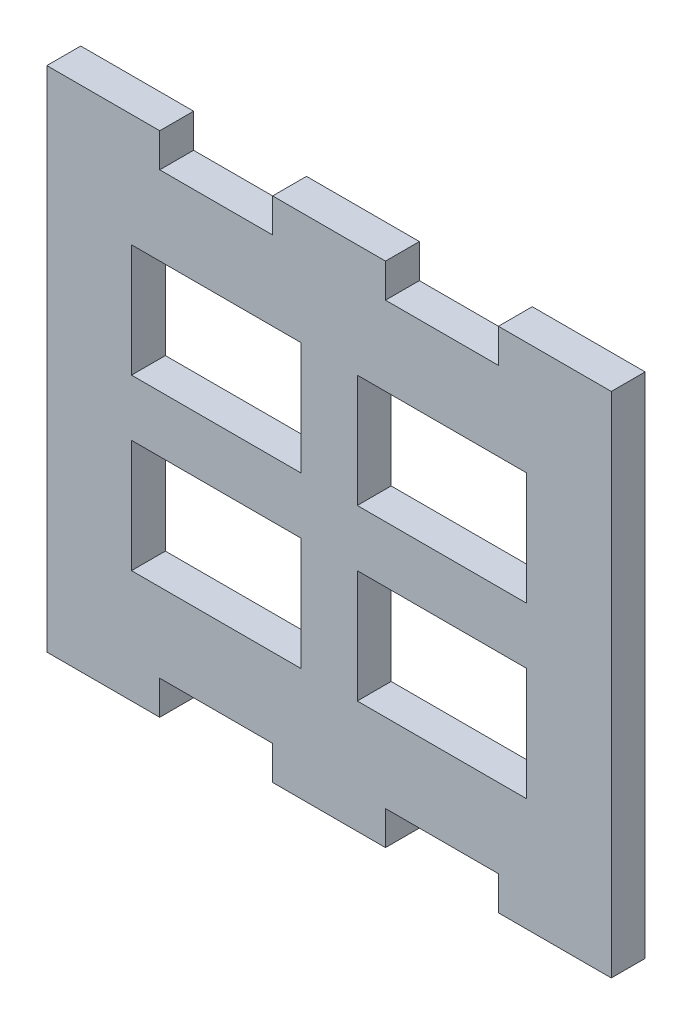
ISO-10303-21;
HEADER;
FILE_DESCRIPTION(('STEP AP214'),'2;1');
FILE_NAME('part.step','',(''),(''),'','','');
FILE_SCHEMA(('AUTOMOTIVE_DESIGN { 1 0 10303 214 1 1 1 1 }'));
ENDSEC;
DATA;
#1=APPLICATION_CONTEXT('core data for automotive mechanical design processes');
#2=APPLICATION_PROTOCOL_DEFINITION('international standard','automotive_design',2000,#1);
#3=PRODUCT_CONTEXT('',#1,'mechanical');
#4=PRODUCT('Part','Part','',(#3));
#5=PRODUCT_RELATED_PRODUCT_CATEGORY('part','',(#4));
#6=PRODUCT_DEFINITION_FORMATION('','',#4);
#7=PRODUCT_DEFINITION_CONTEXT('part definition',#1,'design');
#8=PRODUCT_DEFINITION('design','',#6,#7);
#9=PRODUCT_DEFINITION_SHAPE('','',#8);
#10=(LENGTH_UNIT() NAMED_UNIT(*) SI_UNIT(.MILLI.,.METRE.));
#11=(NAMED_UNIT(*) PLANE_ANGLE_UNIT() SI_UNIT($,.RADIAN.));
#12=(NAMED_UNIT(*) SI_UNIT($,.STERADIAN.) SOLID_ANGLE_UNIT());
#13=UNCERTAINTY_MEASURE_WITH_UNIT(LENGTH_MEASURE(1.E-05),#10,'distance_accuracy_value','');
#14=(GEOMETRIC_REPRESENTATION_CONTEXT(3) GLOBAL_UNCERTAINTY_ASSIGNED_CONTEXT((#13)) GLOBAL_UNIT_ASSIGNED_CONTEXT((#10,
#11,#12)) REPRESENTATION_CONTEXT('',''));
#15=CARTESIAN_POINT('',(0.,0.,0.));
#16=DIRECTION('',(0.,0.,1.));
#17=DIRECTION('',(1.,0.,0.));
#18=AXIS2_PLACEMENT_3D('',#15,#16,#17);
#19=CARTESIAN_POINT('',(0.,45.,3.));
#20=DIRECTION('',(0.,-1.,0.));
#21=DIRECTION('',(0.,0.,-1.));
#22=AXIS2_PLACEMENT_3D('',#19,#20,#21);
#23=PLANE('',#22);
#24=DIRECTION('',(-1.,0.,0.));
#25=VECTOR('',#24,1.);
#26=CARTESIAN_POINT('',(0.,45.,3.));
#27=LINE('',#26,#25);
#28=CARTESIAN_POINT('',(30.,45.,3.));
#29=VERTEX_POINT('',#28);
#30=CARTESIAN_POINT('',(20.,45.,3.));
#31=VERTEX_POINT('',#30);
#32=EDGE_CURVE('E439',#29,#31,#27,.T.);
#33=ORIENTED_EDGE('',*,*,#32,.F.);
#34=DIRECTION('',(0.,0.,1.));
#35=VECTOR('',#34,1.);
#36=CARTESIAN_POINT('',(30.,45.,-7.));
#37=LINE('',#36,#35);
#38=CARTESIAN_POINT('',(30.,45.,0.));
#39=VERTEX_POINT('',#38);
#40=EDGE_CURVE('E279',#39,#29,#37,.T.);
#41=ORIENTED_EDGE('',*,*,#40,.F.);
#42=DIRECTION('',(-1.,0.,0.));
#43=VECTOR('',#42,1.);
#44=CARTESIAN_POINT('',(0.,45.,0.));
#45=LINE('',#44,#43);
#46=CARTESIAN_POINT('',(20.,45.,0.));
#47=VERTEX_POINT('',#46);
#48=EDGE_CURVE('E452',#39,#47,#45,.T.);
#49=ORIENTED_EDGE('',*,*,#48,.T.);
#50=DIRECTION('',(0.,0.,1.));
#51=VECTOR('',#50,1.);
#52=CARTESIAN_POINT('',(20.,45.,-7.));
#53=LINE('',#52,#51);
#54=EDGE_CURVE('E305',#47,#31,#53,.T.);
#55=ORIENTED_EDGE('',*,*,#54,.T.);
#56=EDGE_LOOP('',(#33,#41,#49,#55));
#57=FACE_BOUND('',#56,.T.);
#58=ADVANCED_FACE('F33',(#57),#23,.F.);
#59=CARTESIAN_POINT('',(10.,45.,3.));
#60=VERTEX_POINT('',#59);
#61=CARTESIAN_POINT('',(0.,45.,3.));
#62=VERTEX_POINT('',#61);
#63=EDGE_CURVE('E435',#60,#62,#27,.T.);
#64=ORIENTED_EDGE('',*,*,#63,.F.);
#65=DIRECTION('',(0.,0.,1.));
#66=VECTOR('',#65,1.);
#67=CARTESIAN_POINT('',(10.,45.,-7.));
#68=LINE('',#67,#66);
#69=CARTESIAN_POINT('',(10.,45.,0.));
#70=VERTEX_POINT('',#69);
#71=EDGE_CURVE('E302',#70,#60,#68,.T.);
#72=ORIENTED_EDGE('',*,*,#71,.F.);
#73=CARTESIAN_POINT('',(0.,45.,0.));
#74=VERTEX_POINT('',#73);
#75=EDGE_CURVE('E449',#70,#74,#45,.T.);
#76=ORIENTED_EDGE('',*,*,#75,.T.);
#77=DIRECTION('',(0.,0.,-1.));
#78=VECTOR('',#77,1.);
#79=CARTESIAN_POINT('',(0.,45.,3.));
#80=LINE('',#79,#78);
#81=EDGE_CURVE('E438',#62,#74,#80,.T.);
#82=ORIENTED_EDGE('',*,*,#81,.F.);
#83=EDGE_LOOP('',(#64,#72,#76,#82));
#84=FACE_BOUND('',#83,.T.);
#85=ADVANCED_FACE('F540',(#84),#23,.F.);
#86=CARTESIAN_POINT('',(0.,0.,3.));
#87=DIRECTION('',(0.,1.,0.));
#88=DIRECTION('',(0.,0.,1.));
#89=AXIS2_PLACEMENT_3D('',#86,#87,#88);
#90=PLANE('',#89);
#91=DIRECTION('',(1.,0.,0.));
#92=VECTOR('',#91,1.);
#93=CARTESIAN_POINT('',(0.,0.,0.));
#94=LINE('',#93,#92);
#95=CARTESIAN_POINT('',(20.,0.,0.));
#96=VERTEX_POINT('',#95);
#97=CARTESIAN_POINT('',(30.,0.,0.));
#98=VERTEX_POINT('',#97);
#99=EDGE_CURVE('E447',#96,#98,#94,.T.);
#100=ORIENTED_EDGE('',*,*,#99,.T.);
#101=DIRECTION('',(0.,0.,1.));
#102=VECTOR('',#101,1.);
#103=CARTESIAN_POINT('',(30.,0.,-7.));
#104=LINE('',#103,#102);
#105=CARTESIAN_POINT('',(30.,0.,3.));
#106=VERTEX_POINT('',#105);
#107=EDGE_CURVE('E397',#98,#106,#104,.T.);
#108=ORIENTED_EDGE('',*,*,#107,.T.);
#109=DIRECTION('',(1.,0.,0.));
#110=VECTOR('',#109,1.);
#111=CARTESIAN_POINT('',(0.,0.,3.));
#112=LINE('',#111,#110);
#113=CARTESIAN_POINT('',(20.,0.,3.));
#114=VERTEX_POINT('',#113);
#115=EDGE_CURVE('E433',#114,#106,#112,.T.);
#116=ORIENTED_EDGE('',*,*,#115,.F.);
#117=DIRECTION('',(0.,0.,1.));
#118=VECTOR('',#117,1.);
#119=CARTESIAN_POINT('',(20.,0.,-7.));
#120=LINE('',#119,#118);
#121=EDGE_CURVE('E420',#96,#114,#120,.T.);
#122=ORIENTED_EDGE('',*,*,#121,.F.);
#123=EDGE_LOOP('',(#100,#108,#116,#122));
#124=FACE_BOUND('',#123,.T.);
#125=ADVANCED_FACE('F565',(#124),#90,.F.);
#126=CARTESIAN_POINT('',(0.,0.,0.));
#127=VERTEX_POINT('',#126);
#128=CARTESIAN_POINT('',(10.,0.,0.));
#129=VERTEX_POINT('',#128);
#130=EDGE_CURVE('E443',#127,#129,#94,.T.);
#131=ORIENTED_EDGE('',*,*,#130,.T.);
#132=DIRECTION('',(0.,0.,1.));
#133=VECTOR('',#132,1.);
#134=CARTESIAN_POINT('',(10.,0.,-7.));
#135=LINE('',#134,#133);
#136=CARTESIAN_POINT('',(10.,0.,3.));
#137=VERTEX_POINT('',#136);
#138=EDGE_CURVE('E414',#129,#137,#135,.T.);
#139=ORIENTED_EDGE('',*,*,#138,.T.);
#140=CARTESIAN_POINT('',(0.,0.,3.));
#141=VERTEX_POINT('',#140);
#142=EDGE_CURVE('E429',#141,#137,#112,.T.);
#143=ORIENTED_EDGE('',*,*,#142,.F.);
#144=DIRECTION('',(0.,0.,-1.));
#145=VECTOR('',#144,1.);
#146=CARTESIAN_POINT('',(0.,0.,3.));
#147=LINE('',#146,#145);
#148=EDGE_CURVE('E461',#141,#127,#147,.T.);
#149=ORIENTED_EDGE('',*,*,#148,.T.);
#150=EDGE_LOOP('',(#131,#139,#143,#149));
#151=FACE_BOUND('',#150,.T.);
#152=ADVANCED_FACE('F545',(#151),#90,.F.);
#153=CARTESIAN_POINT('',(0.,0.,3.));
#154=DIRECTION('',(1.,0.,0.));
#155=DIRECTION('',(0.,0.,-1.));
#156=AXIS2_PLACEMENT_3D('',#153,#154,#155);
#157=PLANE('',#156);
#158=DIRECTION('',(0.,-1.,0.));
#159=VECTOR('',#158,1.);
#160=CARTESIAN_POINT('',(0.,0.,0.));
#161=LINE('',#160,#159);
#162=EDGE_CURVE('E417',#74,#127,#161,.T.);
#163=ORIENTED_EDGE('',*,*,#162,.T.);
#164=ORIENTED_EDGE('',*,*,#148,.F.);
#165=DIRECTION('',(0.,-1.,0.));
#166=VECTOR('',#165,1.);
#167=CARTESIAN_POINT('',(0.,0.,3.));
#168=LINE('',#167,#166);
#169=EDGE_CURVE('E424',#62,#141,#168,.T.);
#170=ORIENTED_EDGE('',*,*,#169,.F.);
#171=ORIENTED_EDGE('',*,*,#81,.T.);
#172=EDGE_LOOP('',(#163,#164,#170,#171));
#173=FACE_BOUND('',#172,.T.);
#174=ADVANCED_FACE('F35',(#173),#157,.F.);
#175=CARTESIAN_POINT('',(40.,0.,3.));
#176=VERTEX_POINT('',#175);
#177=CARTESIAN_POINT('',(50.,0.,3.));
#178=VERTEX_POINT('',#177);
#179=EDGE_CURVE('E427',#176,#178,#112,.T.);
#180=ORIENTED_EDGE('',*,*,#179,.F.);
#181=DIRECTION('',(0.,0.,1.));
#182=VECTOR('',#181,1.);
#183=CARTESIAN_POINT('',(40.,0.,-7.));
#184=LINE('',#183,#182);
#185=CARTESIAN_POINT('',(40.,0.,0.));
#186=VERTEX_POINT('',#185);
#187=EDGE_CURVE('E403',#186,#176,#184,.T.);
#188=ORIENTED_EDGE('',*,*,#187,.F.);
#189=CARTESIAN_POINT('',(50.,0.,0.));
#190=VERTEX_POINT('',#189);
#191=EDGE_CURVE('E442',#186,#190,#94,.T.);
#192=ORIENTED_EDGE('',*,*,#191,.T.);
#193=DIRECTION('',(0.,0.,-1.));
#194=VECTOR('',#193,1.);
#195=CARTESIAN_POINT('',(50.,0.,3.));
#196=LINE('',#195,#194);
#197=EDGE_CURVE('E458',#178,#190,#196,.T.);
#198=ORIENTED_EDGE('',*,*,#197,.F.);
#199=EDGE_LOOP('',(#180,#188,#192,#198));
#200=FACE_BOUND('',#199,.T.);
#201=ADVANCED_FACE('F575',(#200),#90,.F.);
#202=CARTESIAN_POINT('',(50.,0.,3.));
#203=DIRECTION('',(-1.,0.,0.));
#204=DIRECTION('',(0.,0.,1.));
#205=AXIS2_PLACEMENT_3D('',#202,#203,#204);
#206=PLANE('',#205);
#207=DIRECTION('',(0.,1.,0.));
#208=VECTOR('',#207,1.);
#209=CARTESIAN_POINT('',(50.,0.,0.));
#210=LINE('',#209,#208);
#211=CARTESIAN_POINT('',(50.,45.,0.));
#212=VERTEX_POINT('',#211);
#213=EDGE_CURVE('E446',#190,#212,#210,.T.);
#214=ORIENTED_EDGE('',*,*,#213,.T.);
#215=DIRECTION('',(0.,0.,-1.));
#216=VECTOR('',#215,1.);
#217=CARTESIAN_POINT('',(50.,45.,3.));
#218=LINE('',#217,#216);
#219=CARTESIAN_POINT('',(50.,45.,3.));
#220=VERTEX_POINT('',#219);
#221=EDGE_CURVE('E455',#220,#212,#218,.T.);
#222=ORIENTED_EDGE('',*,*,#221,.F.);
#223=DIRECTION('',(0.,1.,0.));
#224=VECTOR('',#223,1.);
#225=CARTESIAN_POINT('',(50.,0.,3.));
#226=LINE('',#225,#224);
#227=EDGE_CURVE('E432',#178,#220,#226,.T.);
#228=ORIENTED_EDGE('',*,*,#227,.F.);
#229=ORIENTED_EDGE('',*,*,#197,.T.);
#230=EDGE_LOOP('',(#214,#222,#228,#229));
#231=FACE_BOUND('',#230,.T.);
#232=ADVANCED_FACE('F579',(#231),#206,.F.);
#233=CARTESIAN_POINT('',(40.,45.,0.));
#234=VERTEX_POINT('',#233);
#235=EDGE_CURVE('E428',#212,#234,#45,.T.);
#236=ORIENTED_EDGE('',*,*,#235,.T.);
#237=DIRECTION('',(0.,0.,1.));
#238=VECTOR('',#237,1.);
#239=CARTESIAN_POINT('',(40.,45.,-7.));
#240=LINE('',#239,#238);
#241=CARTESIAN_POINT('',(40.,45.,3.));
#242=VERTEX_POINT('',#241);
#243=EDGE_CURVE('E290',#234,#242,#240,.T.);
#244=ORIENTED_EDGE('',*,*,#243,.T.);
#245=EDGE_CURVE('E436',#220,#242,#27,.T.);
#246=ORIENTED_EDGE('',*,*,#245,.F.);
#247=ORIENTED_EDGE('',*,*,#221,.T.);
#248=EDGE_LOOP('',(#236,#244,#246,#247));
#249=FACE_BOUND('',#248,.T.);
#250=ADVANCED_FACE('F582',(#249),#23,.F.);
#251=CARTESIAN_POINT('',(0.,0.,3.));
#252=DIRECTION('',(0.,0.,-1.));
#253=DIRECTION('',(-1.,0.,0.));
#254=AXIS2_PLACEMENT_3D('',#251,#252,#253);
#255=PLANE('',#254);
#256=DIRECTION('',(1.,0.,0.));
#257=VECTOR('',#256,1.);
#258=CARTESIAN_POINT('',(7.50000000000016,9.99999999999999,3.));
#259=LINE('',#258,#257);
#260=CARTESIAN_POINT('',(7.50000000000016,9.99999999999999,3.));
#261=VERTEX_POINT('',#260);
#262=CARTESIAN_POINT('',(22.5000000000002,9.99999999999999,3.));
#263=VERTEX_POINT('',#262);
#264=EDGE_CURVE('E311',#261,#263,#259,.T.);
#265=ORIENTED_EDGE('',*,*,#264,.F.);
#266=DIRECTION('',(0.,-1.,0.));
#267=VECTOR('',#266,1.);
#268=CARTESIAN_POINT('',(7.50000000000016,20.,3.));
#269=LINE('',#268,#267);
#270=CARTESIAN_POINT('',(7.50000000000016,20.,3.));
#271=VERTEX_POINT('',#270);
#272=EDGE_CURVE('E304',#271,#261,#269,.T.);
#273=ORIENTED_EDGE('',*,*,#272,.F.);
#274=DIRECTION('',(-1.,0.,0.));
#275=VECTOR('',#274,1.);
#276=CARTESIAN_POINT('',(7.50000000000016,20.,3.));
#277=LINE('',#276,#275);
#278=CARTESIAN_POINT('',(22.5000000000002,20.,3.));
#279=VERTEX_POINT('',#278);
#280=EDGE_CURVE('E317',#279,#271,#277,.T.);
#281=ORIENTED_EDGE('',*,*,#280,.F.);
#282=DIRECTION('',(0.,1.,0.));
#283=VECTOR('',#282,1.);
#284=CARTESIAN_POINT('',(22.5000000000002,20.,3.));
#285=LINE('',#284,#283);
#286=EDGE_CURVE('E314',#263,#279,#285,.T.);
#287=ORIENTED_EDGE('',*,*,#286,.F.);
#288=EDGE_LOOP('',(#265,#273,#281,#287));
#289=FACE_BOUND('',#288,.T.);
#290=DIRECTION('',(1.,0.,0.));
#291=VECTOR('',#290,1.);
#292=CARTESIAN_POINT('',(27.5000000000001,9.99999999999999,3.));
#293=LINE('',#292,#291);
#294=CARTESIAN_POINT('',(27.5000000000001,9.99999999999999,3.));
#295=VERTEX_POINT('',#294);
#296=CARTESIAN_POINT('',(42.5000000000001,9.99999999999999,3.));
#297=VERTEX_POINT('',#296);
#298=EDGE_CURVE('E331',#295,#297,#293,.T.);
#299=ORIENTED_EDGE('',*,*,#298,.F.);
#300=DIRECTION('',(0.,-1.,0.));
#301=VECTOR('',#300,1.);
#302=CARTESIAN_POINT('',(27.5000000000001,20.,3.));
#303=LINE('',#302,#301);
#304=CARTESIAN_POINT('',(27.5000000000001,20.,3.));
#305=VERTEX_POINT('',#304);
#306=EDGE_CURVE('E323',#305,#295,#303,.T.);
#307=ORIENTED_EDGE('',*,*,#306,.F.);
#308=DIRECTION('',(-1.,0.,0.));
#309=VECTOR('',#308,1.);
#310=CARTESIAN_POINT('',(27.5000000000001,20.,3.));
#311=LINE('',#310,#309);
#312=CARTESIAN_POINT('',(42.5000000000001,20.,3.));
#313=VERTEX_POINT('',#312);
#314=EDGE_CURVE('E337',#313,#305,#311,.T.);
#315=ORIENTED_EDGE('',*,*,#314,.F.);
#316=DIRECTION('',(0.,1.,0.));
#317=VECTOR('',#316,1.);
#318=CARTESIAN_POINT('',(42.5000000000001,20.,3.));
#319=LINE('',#318,#317);
#320=EDGE_CURVE('E334',#297,#313,#319,.T.);
#321=ORIENTED_EDGE('',*,*,#320,.F.);
#322=EDGE_LOOP('',(#299,#307,#315,#321));
#323=FACE_BOUND('',#322,.T.);
#324=DIRECTION('',(1.,0.,0.));
#325=VECTOR('',#324,1.);
#326=CARTESIAN_POINT('',(27.5,25.,3.));
#327=LINE('',#326,#325);
#328=CARTESIAN_POINT('',(27.5,25.,3.));
#329=VERTEX_POINT('',#328);
#330=CARTESIAN_POINT('',(42.5,25.,3.));
#331=VERTEX_POINT('',#330);
#332=EDGE_CURVE('E351',#329,#331,#327,.T.);
#333=ORIENTED_EDGE('',*,*,#332,.F.);
#334=DIRECTION('',(0.,-1.,0.));
#335=VECTOR('',#334,1.);
#336=CARTESIAN_POINT('',(27.5,35.,3.));
#337=LINE('',#336,#335);
#338=CARTESIAN_POINT('',(27.5,35.,3.));
#339=VERTEX_POINT('',#338);
#340=EDGE_CURVE('E343',#339,#329,#337,.T.);
#341=ORIENTED_EDGE('',*,*,#340,.F.);
#342=DIRECTION('',(-1.,0.,0.));
#343=VECTOR('',#342,1.);
#344=CARTESIAN_POINT('',(27.5,35.,3.));
#345=LINE('',#344,#343);
#346=CARTESIAN_POINT('',(42.5,35.,3.));
#347=VERTEX_POINT('',#346);
#348=EDGE_CURVE('E357',#347,#339,#345,.T.);
#349=ORIENTED_EDGE('',*,*,#348,.F.);
#350=DIRECTION('',(0.,1.,0.));
#351=VECTOR('',#350,1.);
#352=CARTESIAN_POINT('',(42.5,35.,3.));
#353=LINE('',#352,#351);
#354=EDGE_CURVE('E354',#331,#347,#353,.T.);
#355=ORIENTED_EDGE('',*,*,#354,.F.);
#356=EDGE_LOOP('',(#333,#341,#349,#355));
#357=FACE_BOUND('',#356,.T.);
#358=DIRECTION('',(1.,0.,0.));
#359=VECTOR('',#358,1.);
#360=CARTESIAN_POINT('',(7.5,25.,3.));
#361=LINE('',#360,#359);
#362=CARTESIAN_POINT('',(7.5,25.,3.));
#363=VERTEX_POINT('',#362);
#364=CARTESIAN_POINT('',(22.5,25.,3.));
#365=VERTEX_POINT('',#364);
#366=EDGE_CURVE('E371',#363,#365,#361,.T.);
#367=ORIENTED_EDGE('',*,*,#366,.F.);
#368=DIRECTION('',(0.,-1.,0.));
#369=VECTOR('',#368,1.);
#370=CARTESIAN_POINT('',(7.5,35.,3.));
#371=LINE('',#370,#369);
#372=CARTESIAN_POINT('',(7.5,35.,3.));
#373=VERTEX_POINT('',#372);
#374=EDGE_CURVE('E363',#373,#363,#371,.T.);
#375=ORIENTED_EDGE('',*,*,#374,.F.);
#376=DIRECTION('',(-1.,0.,0.));
#377=VECTOR('',#376,1.);
#378=CARTESIAN_POINT('',(7.5,35.,3.));
#379=LINE('',#378,#377);
#380=CARTESIAN_POINT('',(22.5,35.,3.));
#381=VERTEX_POINT('',#380);
#382=EDGE_CURVE('E377',#381,#373,#379,.T.);
#383=ORIENTED_EDGE('',*,*,#382,.F.);
#384=DIRECTION('',(0.,1.,0.));
#385=VECTOR('',#384,1.);
#386=CARTESIAN_POINT('',(22.5,35.,3.));
#387=LINE('',#386,#385);
#388=EDGE_CURVE('E374',#365,#381,#387,.T.);
#389=ORIENTED_EDGE('',*,*,#388,.F.);
#390=EDGE_LOOP('',(#367,#375,#383,#389));
#391=FACE_BOUND('',#390,.T.);
#392=DIRECTION('',(1.,0.,0.));
#393=VECTOR('',#392,1.);
#394=CARTESIAN_POINT('',(30.,42.,3.));
#395=LINE('',#394,#393);
#396=CARTESIAN_POINT('',(30.,42.,3.));
#397=VERTEX_POINT('',#396);
#398=CARTESIAN_POINT('',(40.,42.,3.));
#399=VERTEX_POINT('',#398);
#400=EDGE_CURVE('E267',#397,#399,#395,.T.);
#401=ORIENTED_EDGE('',*,*,#400,.F.);
#402=DIRECTION('',(0.,-1.,0.));
#403=VECTOR('',#402,1.);
#404=CARTESIAN_POINT('',(30.,45.,3.));
#405=LINE('',#404,#403);
#406=EDGE_CURVE('E276',#29,#397,#405,.T.);
#407=ORIENTED_EDGE('',*,*,#406,.F.);
#408=ORIENTED_EDGE('',*,*,#32,.T.);
#409=DIRECTION('',(0.,1.,0.));
#410=VECTOR('',#409,1.);
#411=CARTESIAN_POINT('',(20.,45.,3.));
#412=LINE('',#411,#410);
#413=CARTESIAN_POINT('',(20.,42.,3.));
#414=VERTEX_POINT('',#413);
#415=EDGE_CURVE('E298',#414,#31,#412,.T.);
#416=ORIENTED_EDGE('',*,*,#415,.F.);
#417=DIRECTION('',(1.,0.,0.));
#418=VECTOR('',#417,1.);
#419=CARTESIAN_POINT('',(10.,42.,3.));
#420=LINE('',#419,#418);
#421=CARTESIAN_POINT('',(10.,42.,3.));
#422=VERTEX_POINT('',#421);
#423=EDGE_CURVE('E296',#422,#414,#420,.T.);
#424=ORIENTED_EDGE('',*,*,#423,.F.);
#425=DIRECTION('',(0.,-1.,0.));
#426=VECTOR('',#425,1.);
#427=CARTESIAN_POINT('',(10.,45.,3.));
#428=LINE('',#427,#426);
#429=EDGE_CURVE('E289',#60,#422,#428,.T.);
#430=ORIENTED_EDGE('',*,*,#429,.F.);
#431=ORIENTED_EDGE('',*,*,#63,.T.);
#432=ORIENTED_EDGE('',*,*,#169,.T.);
#433=ORIENTED_EDGE('',*,*,#142,.T.);
#434=DIRECTION('',(0.,-1.,0.));
#435=VECTOR('',#434,1.);
#436=CARTESIAN_POINT('',(10.,3.,3.));
#437=LINE('',#436,#435);
#438=CARTESIAN_POINT('',(10.,3.,3.));
#439=VERTEX_POINT('',#438);
#440=EDGE_CURVE('E400',#439,#137,#437,.T.);
#441=ORIENTED_EDGE('',*,*,#440,.F.);
#442=DIRECTION('',(-1.,0.,0.));
#443=VECTOR('',#442,1.);
#444=CARTESIAN_POINT('',(10.,3.,3.));
#445=LINE('',#444,#443);
#446=CARTESIAN_POINT('',(20.,3.,3.));
#447=VERTEX_POINT('',#446);
#448=EDGE_CURVE('E411',#447,#439,#445,.T.);
#449=ORIENTED_EDGE('',*,*,#448,.F.);
#450=DIRECTION('',(0.,1.,0.));
#451=VECTOR('',#450,1.);
#452=CARTESIAN_POINT('',(20.,3.,3.));
#453=LINE('',#452,#451);
#454=EDGE_CURVE('E408',#114,#447,#453,.T.);
#455=ORIENTED_EDGE('',*,*,#454,.F.);
#456=ORIENTED_EDGE('',*,*,#115,.T.);
#457=DIRECTION('',(0.,-1.,0.));
#458=VECTOR('',#457,1.);
#459=CARTESIAN_POINT('',(30.,3.,3.));
#460=LINE('',#459,#458);
#461=CARTESIAN_POINT('',(30.,3.,3.));
#462=VERTEX_POINT('',#461);
#463=EDGE_CURVE('E383',#462,#106,#460,.T.);
#464=ORIENTED_EDGE('',*,*,#463,.F.);
#465=DIRECTION('',(-1.,0.,0.));
#466=VECTOR('',#465,1.);
#467=CARTESIAN_POINT('',(30.,3.,3.));
#468=LINE('',#467,#466);
#469=CARTESIAN_POINT('',(40.,3.,3.));
#470=VERTEX_POINT('',#469);
#471=EDGE_CURVE('E394',#470,#462,#468,.T.);
#472=ORIENTED_EDGE('',*,*,#471,.F.);
#473=DIRECTION('',(0.,1.,0.));
#474=VECTOR('',#473,1.);
#475=CARTESIAN_POINT('',(40.,3.,3.));
#476=LINE('',#475,#474);
#477=EDGE_CURVE('E391',#176,#470,#476,.T.);
#478=ORIENTED_EDGE('',*,*,#477,.F.);
#479=ORIENTED_EDGE('',*,*,#179,.T.);
#480=ORIENTED_EDGE('',*,*,#227,.T.);
#481=ORIENTED_EDGE('',*,*,#245,.T.);
#482=DIRECTION('',(0.,1.,0.));
#483=VECTOR('',#482,1.);
#484=CARTESIAN_POINT('',(40.,45.,3.));
#485=LINE('',#484,#483);
#486=EDGE_CURVE('E273',#399,#242,#485,.T.);
#487=ORIENTED_EDGE('',*,*,#486,.F.);
#488=EDGE_LOOP('',(#401,#407,#408,#416,#424,#430,#431,#432,#433,#441,#449,#455,#456,#464,#472,
#478,#479,#480,#481,#487));
#489=FACE_BOUND('',#488,.T.);
#490=ADVANCED_FACE('F283',(#289,#323,#357,#391,#489),#255,.F.);
#491=CARTESIAN_POINT('',(0.,0.,0.));
#492=DIRECTION('',(0.,0.,-1.));
#493=DIRECTION('',(-1.,0.,0.));
#494=AXIS2_PLACEMENT_3D('',#491,#492,#493);
#495=PLANE('',#494);
#496=DIRECTION('',(0.,1.,0.));
#497=VECTOR('',#496,1.);
#498=CARTESIAN_POINT('',(30.,0.,0.));
#499=LINE('',#498,#497);
#500=CARTESIAN_POINT('',(30.,42.,0.));
#501=VERTEX_POINT('',#500);
#502=EDGE_CURVE('E11',#501,#39,#499,.T.);
#503=ORIENTED_EDGE('',*,*,#502,.F.);
#504=DIRECTION('',(-1.,0.,0.));
#505=VECTOR('',#504,1.);
#506=CARTESIAN_POINT('',(0.,42.,0.));
#507=LINE('',#506,#505);
#508=CARTESIAN_POINT('',(40.,42.,0.));
#509=VERTEX_POINT('',#508);
#510=EDGE_CURVE('E270',#509,#501,#507,.T.);
#511=ORIENTED_EDGE('',*,*,#510,.F.);
#512=DIRECTION('',(0.,-1.,0.));
#513=VECTOR('',#512,1.);
#514=CARTESIAN_POINT('',(40.,0.,0.));
#515=LINE('',#514,#513);
#516=EDGE_CURVE('E41',#234,#509,#515,.T.);
#517=ORIENTED_EDGE('',*,*,#516,.F.);
#518=ORIENTED_EDGE('',*,*,#235,.F.);
#519=ORIENTED_EDGE('',*,*,#213,.F.);
#520=ORIENTED_EDGE('',*,*,#191,.F.);
#521=DIRECTION('',(0.,-1.,0.));
#522=VECTOR('',#521,1.);
#523=CARTESIAN_POINT('',(40.,0.,0.));
#524=LINE('',#523,#522);
#525=CARTESIAN_POINT('',(40.,3.,0.));
#526=VERTEX_POINT('',#525);
#527=EDGE_CURVE('E471',#526,#186,#524,.T.);
#528=ORIENTED_EDGE('',*,*,#527,.F.);
#529=DIRECTION('',(1.,0.,0.));
#530=VECTOR('',#529,1.);
#531=CARTESIAN_POINT('',(0.,3.,0.));
#532=LINE('',#531,#530);
#533=CARTESIAN_POINT('',(30.,3.,0.));
#534=VERTEX_POINT('',#533);
#535=EDGE_CURVE('E473',#534,#526,#532,.T.);
#536=ORIENTED_EDGE('',*,*,#535,.F.);
#537=DIRECTION('',(0.,1.,0.));
#538=VECTOR('',#537,1.);
#539=CARTESIAN_POINT('',(30.,0.,0.));
#540=LINE('',#539,#538);
#541=EDGE_CURVE('E476',#98,#534,#540,.T.);
#542=ORIENTED_EDGE('',*,*,#541,.F.);
#543=ORIENTED_EDGE('',*,*,#99,.F.);
#544=DIRECTION('',(0.,-1.,0.));
#545=VECTOR('',#544,1.);
#546=CARTESIAN_POINT('',(20.,0.,0.));
#547=LINE('',#546,#545);
#548=CARTESIAN_POINT('',(20.,3.,0.));
#549=VERTEX_POINT('',#548);
#550=EDGE_CURVE('E464',#549,#96,#547,.T.);
#551=ORIENTED_EDGE('',*,*,#550,.F.);
#552=DIRECTION('',(1.,0.,0.));
#553=VECTOR('',#552,1.);
#554=CARTESIAN_POINT('',(0.,3.,0.));
#555=LINE('',#554,#553);
#556=CARTESIAN_POINT('',(10.,3.,0.));
#557=VERTEX_POINT('',#556);
#558=EDGE_CURVE('E466',#557,#549,#555,.T.);
#559=ORIENTED_EDGE('',*,*,#558,.F.);
#560=DIRECTION('',(0.,1.,0.));
#561=VECTOR('',#560,1.);
#562=CARTESIAN_POINT('',(10.,0.,0.));
#563=LINE('',#562,#561);
#564=EDGE_CURVE('E469',#129,#557,#563,.T.);
#565=ORIENTED_EDGE('',*,*,#564,.F.);
#566=ORIENTED_EDGE('',*,*,#130,.F.);
#567=ORIENTED_EDGE('',*,*,#162,.F.);
#568=ORIENTED_EDGE('',*,*,#75,.F.);
#569=DIRECTION('',(0.,1.,0.));
#570=VECTOR('',#569,1.);
#571=CARTESIAN_POINT('',(9.99999999999998,0.,0.));
#572=LINE('',#571,#570);
#573=CARTESIAN_POINT('',(10.,42.,0.));
#574=VERTEX_POINT('',#573);
#575=EDGE_CURVE('E518',#574,#70,#572,.T.);
#576=ORIENTED_EDGE('',*,*,#575,.F.);
#577=DIRECTION('',(-1.,0.,0.));
#578=VECTOR('',#577,1.);
#579=CARTESIAN_POINT('',(0.,42.,0.));
#580=LINE('',#579,#578);
#581=CARTESIAN_POINT('',(20.,42.,0.));
#582=VERTEX_POINT('',#581);
#583=EDGE_CURVE('E514',#582,#574,#580,.T.);
#584=ORIENTED_EDGE('',*,*,#583,.F.);
#585=DIRECTION('',(0.,-1.,0.));
#586=VECTOR('',#585,1.);
#587=CARTESIAN_POINT('',(20.,0.,0.));
#588=LINE('',#587,#586);
#589=EDGE_CURVE('E516',#47,#582,#588,.T.);
#590=ORIENTED_EDGE('',*,*,#589,.F.);
#591=ORIENTED_EDGE('',*,*,#48,.F.);
#592=EDGE_LOOP('',(#503,#511,#517,#518,#519,#520,#528,#536,#542,#543,#551,#559,#565,#566,#567,
#568,#576,#584,#590,#591));
#593=FACE_BOUND('',#592,.T.);
#594=DIRECTION('',(0.,1.,0.));
#595=VECTOR('',#594,1.);
#596=CARTESIAN_POINT('',(7.50000000000016,0.,0.));
#597=LINE('',#596,#595);
#598=CARTESIAN_POINT('',(7.50000000000016,9.99999999999999,0.));
#599=VERTEX_POINT('',#598);
#600=CARTESIAN_POINT('',(7.50000000000016,20.,0.));
#601=VERTEX_POINT('',#600);
#602=EDGE_CURVE('E512',#599,#601,#597,.T.);
#603=ORIENTED_EDGE('',*,*,#602,.F.);
#604=DIRECTION('',(-1.,0.,0.));
#605=VECTOR('',#604,1.);
#606=CARTESIAN_POINT('',(0.,9.99999999999999,0.));
#607=LINE('',#606,#605);
#608=CARTESIAN_POINT('',(22.5000000000002,9.99999999999999,0.));
#609=VERTEX_POINT('',#608);
#610=EDGE_CURVE('E505',#609,#599,#607,.T.);
#611=ORIENTED_EDGE('',*,*,#610,.F.);
#612=DIRECTION('',(0.,-1.,0.));
#613=VECTOR('',#612,1.);
#614=CARTESIAN_POINT('',(22.5000000000002,0.,0.));
#615=LINE('',#614,#613);
#616=CARTESIAN_POINT('',(22.5000000000002,20.,0.));
#617=VERTEX_POINT('',#616);
#618=EDGE_CURVE('E507',#617,#609,#615,.T.);
#619=ORIENTED_EDGE('',*,*,#618,.F.);
#620=DIRECTION('',(1.,0.,0.));
#621=VECTOR('',#620,1.);
#622=CARTESIAN_POINT('',(0.,20.,0.));
#623=LINE('',#622,#621);
#624=EDGE_CURVE('E510',#601,#617,#623,.T.);
#625=ORIENTED_EDGE('',*,*,#624,.F.);
#626=EDGE_LOOP('',(#603,#611,#619,#625));
#627=FACE_BOUND('',#626,.T.);
#628=DIRECTION('',(0.,1.,0.));
#629=VECTOR('',#628,1.);
#630=CARTESIAN_POINT('',(27.5000000000002,0.,0.));
#631=LINE('',#630,#629);
#632=CARTESIAN_POINT('',(27.5000000000001,9.99999999999999,0.));
#633=VERTEX_POINT('',#632);
#634=CARTESIAN_POINT('',(27.5000000000001,20.,0.));
#635=VERTEX_POINT('',#634);
#636=EDGE_CURVE('E503',#633,#635,#631,.T.);
#637=ORIENTED_EDGE('',*,*,#636,.F.);
#638=DIRECTION('',(-1.,0.,0.));
#639=VECTOR('',#638,1.);
#640=CARTESIAN_POINT('',(0.,9.99999999999999,0.));
#641=LINE('',#640,#639);
#642=CARTESIAN_POINT('',(42.5000000000001,9.99999999999999,0.));
#643=VERTEX_POINT('',#642);
#644=EDGE_CURVE('E496',#643,#633,#641,.T.);
#645=ORIENTED_EDGE('',*,*,#644,.F.);
#646=DIRECTION('',(0.,-1.,0.));
#647=VECTOR('',#646,1.);
#648=CARTESIAN_POINT('',(42.5000000000001,0.,0.));
#649=LINE('',#648,#647);
#650=CARTESIAN_POINT('',(42.5000000000001,20.,0.));
#651=VERTEX_POINT('',#650);
#652=EDGE_CURVE('E498',#651,#643,#649,.T.);
#653=ORIENTED_EDGE('',*,*,#652,.F.);
#654=DIRECTION('',(1.,0.,0.));
#655=VECTOR('',#654,1.);
#656=CARTESIAN_POINT('',(0.,20.,0.));
#657=LINE('',#656,#655);
#658=EDGE_CURVE('E501',#635,#651,#657,.T.);
#659=ORIENTED_EDGE('',*,*,#658,.F.);
#660=EDGE_LOOP('',(#637,#645,#653,#659));
#661=FACE_BOUND('',#660,.T.);
#662=DIRECTION('',(0.,1.,0.));
#663=VECTOR('',#662,1.);
#664=CARTESIAN_POINT('',(27.5,0.,0.));
#665=LINE('',#664,#663);
#666=CARTESIAN_POINT('',(27.5,25.,0.));
#667=VERTEX_POINT('',#666);
#668=CARTESIAN_POINT('',(27.5,35.,0.));
#669=VERTEX_POINT('',#668);
#670=EDGE_CURVE('E494',#667,#669,#665,.T.);
#671=ORIENTED_EDGE('',*,*,#670,.F.);
#672=DIRECTION('',(-1.,0.,0.));
#673=VECTOR('',#672,1.);
#674=CARTESIAN_POINT('',(0.,25.,0.));
#675=LINE('',#674,#673);
#676=CARTESIAN_POINT('',(42.5,25.,0.));
#677=VERTEX_POINT('',#676);
#678=EDGE_CURVE('E487',#677,#667,#675,.T.);
#679=ORIENTED_EDGE('',*,*,#678,.F.);
#680=DIRECTION('',(0.,-1.,0.));
#681=VECTOR('',#680,1.);
#682=CARTESIAN_POINT('',(42.5,0.,0.));
#683=LINE('',#682,#681);
#684=CARTESIAN_POINT('',(42.5,35.,0.));
#685=VERTEX_POINT('',#684);
#686=EDGE_CURVE('E489',#685,#677,#683,.T.);
#687=ORIENTED_EDGE('',*,*,#686,.F.);
#688=DIRECTION('',(1.,0.,0.));
#689=VECTOR('',#688,1.);
#690=CARTESIAN_POINT('',(0.,35.,0.));
#691=LINE('',#690,#689);
#692=EDGE_CURVE('E492',#669,#685,#691,.T.);
#693=ORIENTED_EDGE('',*,*,#692,.F.);
#694=EDGE_LOOP('',(#671,#679,#687,#693));
#695=FACE_BOUND('',#694,.T.);
#696=DIRECTION('',(0.,1.,0.));
#697=VECTOR('',#696,1.);
#698=CARTESIAN_POINT('',(7.50000000000001,0.,0.));
#699=LINE('',#698,#697);
#700=CARTESIAN_POINT('',(7.5,25.,0.));
#701=VERTEX_POINT('',#700);
#702=CARTESIAN_POINT('',(7.5,35.,0.));
#703=VERTEX_POINT('',#702);
#704=EDGE_CURVE('E485',#701,#703,#699,.T.);
#705=ORIENTED_EDGE('',*,*,#704,.F.);
#706=DIRECTION('',(-1.,0.,0.));
#707=VECTOR('',#706,1.);
#708=CARTESIAN_POINT('',(0.,25.,0.));
#709=LINE('',#708,#707);
#710=CARTESIAN_POINT('',(22.5,25.,0.));
#711=VERTEX_POINT('',#710);
#712=EDGE_CURVE('E478',#711,#701,#709,.T.);
#713=ORIENTED_EDGE('',*,*,#712,.F.);
#714=DIRECTION('',(0.,-1.,0.));
#715=VECTOR('',#714,1.);
#716=CARTESIAN_POINT('',(22.5,0.,0.));
#717=LINE('',#716,#715);
#718=CARTESIAN_POINT('',(22.5,35.,0.));
#719=VERTEX_POINT('',#718);
#720=EDGE_CURVE('E480',#719,#711,#717,.T.);
#721=ORIENTED_EDGE('',*,*,#720,.F.);
#722=DIRECTION('',(1.,0.,0.));
#723=VECTOR('',#722,1.);
#724=CARTESIAN_POINT('',(0.,35.,0.));
#725=LINE('',#724,#723);
#726=EDGE_CURVE('E483',#703,#719,#725,.T.);
#727=ORIENTED_EDGE('',*,*,#726,.F.);
#728=EDGE_LOOP('',(#705,#713,#721,#727));
#729=FACE_BOUND('',#728,.T.);
#730=ADVANCED_FACE('F525',(#593,#627,#661,#695,#729),#495,.T.);
#731=CARTESIAN_POINT('',(10.,3.,-7.));
#732=DIRECTION('',(-1.,0.,0.));
#733=DIRECTION('',(0.,-1.,0.));
#734=AXIS2_PLACEMENT_3D('',#731,#732,#733);
#735=PLANE('',#734);
#736=ORIENTED_EDGE('',*,*,#564,.T.);
#737=DIRECTION('',(0.,0.,1.));
#738=VECTOR('',#737,1.);
#739=CARTESIAN_POINT('',(10.,3.,-7.));
#740=LINE('',#739,#738);
#741=EDGE_CURVE('E415',#557,#439,#740,.T.);
#742=ORIENTED_EDGE('',*,*,#741,.T.);
#743=ORIENTED_EDGE('',*,*,#440,.T.);
#744=ORIENTED_EDGE('',*,*,#138,.F.);
#745=EDGE_LOOP('',(#736,#742,#743,#744));
#746=FACE_BOUND('',#745,.T.);
#747=ADVANCED_FACE('F550',(#746),#735,.F.);
#748=CARTESIAN_POINT('',(10.,3.,-7.));
#749=DIRECTION('',(0.,1.,0.));
#750=DIRECTION('',(-1.,0.,0.));
#751=AXIS2_PLACEMENT_3D('',#748,#749,#750);
#752=PLANE('',#751);
#753=ORIENTED_EDGE('',*,*,#558,.T.);
#754=DIRECTION('',(0.,0.,1.));
#755=VECTOR('',#754,1.);
#756=CARTESIAN_POINT('',(20.,3.,-7.));
#757=LINE('',#756,#755);
#758=EDGE_CURVE('E418',#549,#447,#757,.T.);
#759=ORIENTED_EDGE('',*,*,#758,.T.);
#760=ORIENTED_EDGE('',*,*,#448,.T.);
#761=ORIENTED_EDGE('',*,*,#741,.F.);
#762=EDGE_LOOP('',(#753,#759,#760,#761));
#763=FACE_BOUND('',#762,.T.);
#764=ADVANCED_FACE('F555',(#763),#752,.F.);
#765=CARTESIAN_POINT('',(20.,3.,-7.));
#766=DIRECTION('',(1.,0.,0.));
#767=DIRECTION('',(0.,0.,-1.));
#768=AXIS2_PLACEMENT_3D('',#765,#766,#767);
#769=PLANE('',#768);
#770=ORIENTED_EDGE('',*,*,#550,.T.);
#771=ORIENTED_EDGE('',*,*,#121,.T.);
#772=ORIENTED_EDGE('',*,*,#454,.T.);
#773=ORIENTED_EDGE('',*,*,#758,.F.);
#774=EDGE_LOOP('',(#770,#771,#772,#773));
#775=FACE_BOUND('',#774,.T.);
#776=ADVANCED_FACE('F558',(#775),#769,.F.);
#777=CARTESIAN_POINT('',(30.,3.,-7.));
#778=DIRECTION('',(-1.,0.,0.));
#779=DIRECTION('',(0.,-1.,0.));
#780=AXIS2_PLACEMENT_3D('',#777,#778,#779);
#781=PLANE('',#780);
#782=ORIENTED_EDGE('',*,*,#541,.T.);
#783=DIRECTION('',(0.,0.,1.));
#784=VECTOR('',#783,1.);
#785=CARTESIAN_POINT('',(30.,3.,-7.));
#786=LINE('',#785,#784);
#787=EDGE_CURVE('E398',#534,#462,#786,.T.);
#788=ORIENTED_EDGE('',*,*,#787,.T.);
#789=ORIENTED_EDGE('',*,*,#463,.T.);
#790=ORIENTED_EDGE('',*,*,#107,.F.);
#791=EDGE_LOOP('',(#782,#788,#789,#790));
#792=FACE_BOUND('',#791,.T.);
#793=ADVANCED_FACE('F588',(#792),#781,.F.);
#794=CARTESIAN_POINT('',(30.,3.,-7.));
#795=DIRECTION('',(0.,1.,0.));
#796=DIRECTION('',(-1.,0.,0.));
#797=AXIS2_PLACEMENT_3D('',#794,#795,#796);
#798=PLANE('',#797);
#799=ORIENTED_EDGE('',*,*,#535,.T.);
#800=DIRECTION('',(0.,0.,1.));
#801=VECTOR('',#800,1.);
#802=CARTESIAN_POINT('',(40.,3.,-7.));
#803=LINE('',#802,#801);
#804=EDGE_CURVE('E401',#526,#470,#803,.T.);
#805=ORIENTED_EDGE('',*,*,#804,.T.);
#806=ORIENTED_EDGE('',*,*,#471,.T.);
#807=ORIENTED_EDGE('',*,*,#787,.F.);
#808=EDGE_LOOP('',(#799,#805,#806,#807));
#809=FACE_BOUND('',#808,.T.);
#810=ADVANCED_FACE('F590',(#809),#798,.F.);
#811=CARTESIAN_POINT('',(40.,3.,-7.));
#812=DIRECTION('',(1.,0.,0.));
#813=DIRECTION('',(0.,0.,-1.));
#814=AXIS2_PLACEMENT_3D('',#811,#812,#813);
#815=PLANE('',#814);
#816=ORIENTED_EDGE('',*,*,#527,.T.);
#817=ORIENTED_EDGE('',*,*,#187,.T.);
#818=ORIENTED_EDGE('',*,*,#477,.T.);
#819=ORIENTED_EDGE('',*,*,#804,.F.);
#820=EDGE_LOOP('',(#816,#817,#818,#819));
#821=FACE_BOUND('',#820,.T.);
#822=ADVANCED_FACE('F592',(#821),#815,.F.);
#823=CARTESIAN_POINT('',(7.5,35.,-7.));
#824=DIRECTION('',(-1.,0.,0.));
#825=DIRECTION('',(0.,-1.,0.));
#826=AXIS2_PLACEMENT_3D('',#823,#824,#825);
#827=PLANE('',#826);
#828=ORIENTED_EDGE('',*,*,#704,.T.);
#829=DIRECTION('',(0.,0.,1.));
#830=VECTOR('',#829,1.);
#831=CARTESIAN_POINT('',(7.5,35.,-7.));
#832=LINE('',#831,#830);
#833=EDGE_CURVE('E381',#703,#373,#832,.T.);
#834=ORIENTED_EDGE('',*,*,#833,.T.);
#835=ORIENTED_EDGE('',*,*,#374,.T.);
#836=DIRECTION('',(0.,0.,1.));
#837=VECTOR('',#836,1.);
#838=CARTESIAN_POINT('',(7.5,25.,-7.));
#839=LINE('',#838,#837);
#840=EDGE_CURVE('E380',#701,#363,#839,.T.);
#841=ORIENTED_EDGE('',*,*,#840,.F.);
#842=EDGE_LOOP('',(#828,#834,#835,#841));
#843=FACE_BOUND('',#842,.T.);
#844=ADVANCED_FACE('F594',(#843),#827,.F.);
#845=CARTESIAN_POINT('',(7.5,35.,-7.));
#846=DIRECTION('',(0.,1.,0.));
#847=DIRECTION('',(0.,0.,1.));
#848=AXIS2_PLACEMENT_3D('',#845,#846,#847);
#849=PLANE('',#848);
#850=ORIENTED_EDGE('',*,*,#726,.T.);
#851=DIRECTION('',(0.,0.,1.));
#852=VECTOR('',#851,1.);
#853=CARTESIAN_POINT('',(22.5,35.,-7.));
#854=LINE('',#853,#852);
#855=EDGE_CURVE('E384',#719,#381,#854,.T.);
#856=ORIENTED_EDGE('',*,*,#855,.T.);
#857=ORIENTED_EDGE('',*,*,#382,.T.);
#858=ORIENTED_EDGE('',*,*,#833,.F.);
#859=EDGE_LOOP('',(#850,#856,#857,#858));
#860=FACE_BOUND('',#859,.T.);
#861=ADVANCED_FACE('F600',(#860),#849,.F.);
#862=CARTESIAN_POINT('',(22.5,35.,-7.));
#863=DIRECTION('',(1.,0.,0.));
#864=DIRECTION('',(0.,1.,0.));
#865=AXIS2_PLACEMENT_3D('',#862,#863,#864);
#866=PLANE('',#865);
#867=ORIENTED_EDGE('',*,*,#720,.T.);
#868=DIRECTION('',(0.,0.,1.));
#869=VECTOR('',#868,1.);
#870=CARTESIAN_POINT('',(22.5,25.,-7.));
#871=LINE('',#870,#869);
#872=EDGE_CURVE('E386',#711,#365,#871,.T.);
#873=ORIENTED_EDGE('',*,*,#872,.T.);
#874=ORIENTED_EDGE('',*,*,#388,.T.);
#875=ORIENTED_EDGE('',*,*,#855,.F.);
#876=EDGE_LOOP('',(#867,#873,#874,#875));
#877=FACE_BOUND('',#876,.T.);
#878=ADVANCED_FACE('F699',(#877),#866,.F.);
#879=CARTESIAN_POINT('',(7.5,25.,-7.));
#880=DIRECTION('',(0.,-1.,0.));
#881=DIRECTION('',(0.,0.,-1.));
#882=AXIS2_PLACEMENT_3D('',#879,#880,#881);
#883=PLANE('',#882);
#884=ORIENTED_EDGE('',*,*,#712,.T.);
#885=ORIENTED_EDGE('',*,*,#840,.T.);
#886=ORIENTED_EDGE('',*,*,#366,.T.);
#887=ORIENTED_EDGE('',*,*,#872,.F.);
#888=EDGE_LOOP('',(#884,#885,#886,#887));
#889=FACE_BOUND('',#888,.T.);
#890=ADVANCED_FACE('F708',(#889),#883,.F.);
#891=CARTESIAN_POINT('',(27.5,35.,-7.));
#892=DIRECTION('',(-1.,0.,0.));
#893=DIRECTION('',(0.,0.,1.));
#894=AXIS2_PLACEMENT_3D('',#891,#892,#893);
#895=PLANE('',#894);
#896=ORIENTED_EDGE('',*,*,#670,.T.);
#897=DIRECTION('',(0.,0.,1.));
#898=VECTOR('',#897,1.);
#899=CARTESIAN_POINT('',(27.5,35.,-7.));
#900=LINE('',#899,#898);
#901=EDGE_CURVE('E361',#669,#339,#900,.T.);
#902=ORIENTED_EDGE('',*,*,#901,.T.);
#903=ORIENTED_EDGE('',*,*,#340,.T.);
#904=DIRECTION('',(0.,0.,1.));
#905=VECTOR('',#904,1.);
#906=CARTESIAN_POINT('',(27.5,25.,-7.));
#907=LINE('',#906,#905);
#908=EDGE_CURVE('E360',#667,#329,#907,.T.);
#909=ORIENTED_EDGE('',*,*,#908,.F.);
#910=EDGE_LOOP('',(#896,#902,#903,#909));
#911=FACE_BOUND('',#910,.T.);
#912=ADVANCED_FACE('F717',(#911),#895,.F.);
#913=CARTESIAN_POINT('',(27.5,35.,-7.));
#914=DIRECTION('',(0.,1.,0.));
#915=DIRECTION('',(0.,0.,1.));
#916=AXIS2_PLACEMENT_3D('',#913,#914,#915);
#917=PLANE('',#916);
#918=ORIENTED_EDGE('',*,*,#692,.T.);
#919=DIRECTION('',(0.,0.,1.));
#920=VECTOR('',#919,1.);
#921=CARTESIAN_POINT('',(42.5,35.,-7.));
#922=LINE('',#921,#920);
#923=EDGE_CURVE('E364',#685,#347,#922,.T.);
#924=ORIENTED_EDGE('',*,*,#923,.T.);
#925=ORIENTED_EDGE('',*,*,#348,.T.);
#926=ORIENTED_EDGE('',*,*,#901,.F.);
#927=EDGE_LOOP('',(#918,#924,#925,#926));
#928=FACE_BOUND('',#927,.T.);
#929=ADVANCED_FACE('F726',(#928),#917,.F.);
#930=CARTESIAN_POINT('',(42.5,35.,-7.));
#931=DIRECTION('',(1.,0.,0.));
#932=DIRECTION('',(0.,1.,0.));
#933=AXIS2_PLACEMENT_3D('',#930,#931,#932);
#934=PLANE('',#933);
#935=ORIENTED_EDGE('',*,*,#686,.T.);
#936=DIRECTION('',(0.,0.,1.));
#937=VECTOR('',#936,1.);
#938=CARTESIAN_POINT('',(42.5,25.,-7.));
#939=LINE('',#938,#937);
#940=EDGE_CURVE('E366',#677,#331,#939,.T.);
#941=ORIENTED_EDGE('',*,*,#940,.T.);
#942=ORIENTED_EDGE('',*,*,#354,.T.);
#943=ORIENTED_EDGE('',*,*,#923,.F.);
#944=EDGE_LOOP('',(#935,#941,#942,#943));
#945=FACE_BOUND('',#944,.T.);
#946=ADVANCED_FACE('F735',(#945),#934,.F.);
#947=CARTESIAN_POINT('',(27.5,25.,-7.));
#948=DIRECTION('',(0.,-1.,0.));
#949=DIRECTION('',(0.,0.,-1.));
#950=AXIS2_PLACEMENT_3D('',#947,#948,#949);
#951=PLANE('',#950);
#952=ORIENTED_EDGE('',*,*,#678,.T.);
#953=ORIENTED_EDGE('',*,*,#908,.T.);
#954=ORIENTED_EDGE('',*,*,#332,.T.);
#955=ORIENTED_EDGE('',*,*,#940,.F.);
#956=EDGE_LOOP('',(#952,#953,#954,#955));
#957=FACE_BOUND('',#956,.T.);
#958=ADVANCED_FACE('F744',(#957),#951,.F.);
#959=CARTESIAN_POINT('',(27.5000000000001,20.,-7.));
#960=DIRECTION('',(-1.,0.,0.));
#961=DIRECTION('',(0.,-1.,0.));
#962=AXIS2_PLACEMENT_3D('',#959,#960,#961);
#963=PLANE('',#962);
#964=ORIENTED_EDGE('',*,*,#636,.T.);
#965=DIRECTION('',(0.,0.,1.));
#966=VECTOR('',#965,1.);
#967=CARTESIAN_POINT('',(27.5000000000001,20.,-7.));
#968=LINE('',#967,#966);
#969=EDGE_CURVE('E341',#635,#305,#968,.T.);
#970=ORIENTED_EDGE('',*,*,#969,.T.);
#971=ORIENTED_EDGE('',*,*,#306,.T.);
#972=DIRECTION('',(0.,0.,1.));
#973=VECTOR('',#972,1.);
#974=CARTESIAN_POINT('',(27.5000000000001,9.99999999999999,-7.));
#975=LINE('',#974,#973);
#976=EDGE_CURVE('E340',#633,#295,#975,.T.);
#977=ORIENTED_EDGE('',*,*,#976,.F.);
#978=EDGE_LOOP('',(#964,#970,#971,#977));
#979=FACE_BOUND('',#978,.T.);
#980=ADVANCED_FACE('F753',(#979),#963,.F.);
#981=CARTESIAN_POINT('',(27.5000000000001,20.,-7.));
#982=DIRECTION('',(0.,1.,0.));
#983=DIRECTION('',(0.,0.,1.));
#984=AXIS2_PLACEMENT_3D('',#981,#982,#983);
#985=PLANE('',#984);
#986=ORIENTED_EDGE('',*,*,#658,.T.);
#987=DIRECTION('',(0.,0.,1.));
#988=VECTOR('',#987,1.);
#989=CARTESIAN_POINT('',(42.5000000000001,20.,-7.));
#990=LINE('',#989,#988);
#991=EDGE_CURVE('E344',#651,#313,#990,.T.);
#992=ORIENTED_EDGE('',*,*,#991,.T.);
#993=ORIENTED_EDGE('',*,*,#314,.T.);
#994=ORIENTED_EDGE('',*,*,#969,.F.);
#995=EDGE_LOOP('',(#986,#992,#993,#994));
#996=FACE_BOUND('',#995,.T.);
#997=ADVANCED_FACE('F762',(#996),#985,.F.);
#998=CARTESIAN_POINT('',(42.5000000000001,20.,-7.));
#999=DIRECTION('',(1.,0.,0.));
#1000=DIRECTION('',(0.,0.,-1.));
#1001=AXIS2_PLACEMENT_3D('',#998,#999,#1000);
#1002=PLANE('',#1001);
#1003=ORIENTED_EDGE('',*,*,#652,.T.);
#1004=DIRECTION('',(0.,0.,1.));
#1005=VECTOR('',#1004,1.);
#1006=CARTESIAN_POINT('',(42.5000000000001,9.99999999999999,-7.));
#1007=LINE('',#1006,#1005);
#1008=EDGE_CURVE('E346',#643,#297,#1007,.T.);
#1009=ORIENTED_EDGE('',*,*,#1008,.T.);
#1010=ORIENTED_EDGE('',*,*,#320,.T.);
#1011=ORIENTED_EDGE('',*,*,#991,.F.);
#1012=EDGE_LOOP('',(#1003,#1009,#1010,#1011));
#1013=FACE_BOUND('',#1012,.T.);
#1014=ADVANCED_FACE('F771',(#1013),#1002,.F.);
#1015=CARTESIAN_POINT('',(27.5000000000001,9.99999999999999,-7.));
#1016=DIRECTION('',(0.,-1.,0.));
#1017=DIRECTION('',(0.,0.,-1.));
#1018=AXIS2_PLACEMENT_3D('',#1015,#1016,#1017);
#1019=PLANE('',#1018);
#1020=ORIENTED_EDGE('',*,*,#644,.T.);
#1021=ORIENTED_EDGE('',*,*,#976,.T.);
#1022=ORIENTED_EDGE('',*,*,#298,.T.);
#1023=ORIENTED_EDGE('',*,*,#1008,.F.);
#1024=EDGE_LOOP('',(#1020,#1021,#1022,#1023));
#1025=FACE_BOUND('',#1024,.T.);
#1026=ADVANCED_FACE('F780',(#1025),#1019,.F.);
#1027=CARTESIAN_POINT('',(7.50000000000016,20.,-7.));
#1028=DIRECTION('',(-1.,0.,0.));
#1029=DIRECTION('',(0.,-1.,0.));
#1030=AXIS2_PLACEMENT_3D('',#1027,#1028,#1029);
#1031=PLANE('',#1030);
#1032=ORIENTED_EDGE('',*,*,#602,.T.);
#1033=DIRECTION('',(0.,0.,1.));
#1034=VECTOR('',#1033,1.);
#1035=CARTESIAN_POINT('',(7.50000000000016,20.,-7.));
#1036=LINE('',#1035,#1034);
#1037=EDGE_CURVE('E321',#601,#271,#1036,.T.);
#1038=ORIENTED_EDGE('',*,*,#1037,.T.);
#1039=ORIENTED_EDGE('',*,*,#272,.T.);
#1040=DIRECTION('',(0.,0.,1.));
#1041=VECTOR('',#1040,1.);
#1042=CARTESIAN_POINT('',(7.50000000000016,9.99999999999999,-7.));
#1043=LINE('',#1042,#1041);
#1044=EDGE_CURVE('E320',#599,#261,#1043,.T.);
#1045=ORIENTED_EDGE('',*,*,#1044,.F.);
#1046=EDGE_LOOP('',(#1032,#1038,#1039,#1045));
#1047=FACE_BOUND('',#1046,.T.);
#1048=ADVANCED_FACE('F789',(#1047),#1031,.F.);
#1049=CARTESIAN_POINT('',(7.50000000000016,20.,-7.));
#1050=DIRECTION('',(0.,1.,0.));
#1051=DIRECTION('',(0.,0.,1.));
#1052=AXIS2_PLACEMENT_3D('',#1049,#1050,#1051);
#1053=PLANE('',#1052);
#1054=ORIENTED_EDGE('',*,*,#624,.T.);
#1055=DIRECTION('',(0.,0.,1.));
#1056=VECTOR('',#1055,1.);
#1057=CARTESIAN_POINT('',(22.5000000000002,20.,-7.));
#1058=LINE('',#1057,#1056);
#1059=EDGE_CURVE('E324',#617,#279,#1058,.T.);
#1060=ORIENTED_EDGE('',*,*,#1059,.T.);
#1061=ORIENTED_EDGE('',*,*,#280,.T.);
#1062=ORIENTED_EDGE('',*,*,#1037,.F.);
#1063=EDGE_LOOP('',(#1054,#1060,#1061,#1062));
#1064=FACE_BOUND('',#1063,.T.);
#1065=ADVANCED_FACE('F798',(#1064),#1053,.F.);
#1066=CARTESIAN_POINT('',(22.5000000000002,20.,-7.));
#1067=DIRECTION('',(1.,0.,0.));
#1068=DIRECTION('',(0.,1.,0.));
#1069=AXIS2_PLACEMENT_3D('',#1066,#1067,#1068);
#1070=PLANE('',#1069);
#1071=ORIENTED_EDGE('',*,*,#618,.T.);
#1072=DIRECTION('',(0.,0.,1.));
#1073=VECTOR('',#1072,1.);
#1074=CARTESIAN_POINT('',(22.5000000000002,9.99999999999999,-7.));
#1075=LINE('',#1074,#1073);
#1076=EDGE_CURVE('E326',#609,#263,#1075,.T.);
#1077=ORIENTED_EDGE('',*,*,#1076,.T.);
#1078=ORIENTED_EDGE('',*,*,#286,.T.);
#1079=ORIENTED_EDGE('',*,*,#1059,.F.);
#1080=EDGE_LOOP('',(#1071,#1077,#1078,#1079));
#1081=FACE_BOUND('',#1080,.T.);
#1082=ADVANCED_FACE('F807',(#1081),#1070,.F.);
#1083=CARTESIAN_POINT('',(7.50000000000016,9.99999999999999,-7.));
#1084=DIRECTION('',(0.,-1.,0.));
#1085=DIRECTION('',(0.,0.,-1.));
#1086=AXIS2_PLACEMENT_3D('',#1083,#1084,#1085);
#1087=PLANE('',#1086);
#1088=ORIENTED_EDGE('',*,*,#610,.T.);
#1089=ORIENTED_EDGE('',*,*,#1044,.T.);
#1090=ORIENTED_EDGE('',*,*,#264,.T.);
#1091=ORIENTED_EDGE('',*,*,#1076,.F.);
#1092=EDGE_LOOP('',(#1088,#1089,#1090,#1091));
#1093=FACE_BOUND('',#1092,.T.);
#1094=ADVANCED_FACE('F816',(#1093),#1087,.F.);
#1095=CARTESIAN_POINT('',(10.,45.,-7.));
#1096=DIRECTION('',(-1.,0.,0.));
#1097=DIRECTION('',(0.,-1.,0.));
#1098=AXIS2_PLACEMENT_3D('',#1095,#1096,#1097);
#1099=PLANE('',#1098);
#1100=ORIENTED_EDGE('',*,*,#575,.T.);
#1101=ORIENTED_EDGE('',*,*,#71,.T.);
#1102=ORIENTED_EDGE('',*,*,#429,.T.);
#1103=DIRECTION('',(0.,0.,1.));
#1104=VECTOR('',#1103,1.);
#1105=CARTESIAN_POINT('',(10.,42.,-7.));
#1106=LINE('',#1105,#1104);
#1107=EDGE_CURVE('E301',#574,#422,#1106,.T.);
#1108=ORIENTED_EDGE('',*,*,#1107,.F.);
#1109=EDGE_LOOP('',(#1100,#1101,#1102,#1108));
#1110=FACE_BOUND('',#1109,.T.);
#1111=ADVANCED_FACE('F825',(#1110),#1099,.F.);
#1112=CARTESIAN_POINT('',(20.,45.,-7.));
#1113=DIRECTION('',(1.,0.,0.));
#1114=DIRECTION('',(0.,0.,-1.));
#1115=AXIS2_PLACEMENT_3D('',#1112,#1113,#1114);
#1116=PLANE('',#1115);
#1117=ORIENTED_EDGE('',*,*,#589,.T.);
#1118=DIRECTION('',(0.,0.,1.));
#1119=VECTOR('',#1118,1.);
#1120=CARTESIAN_POINT('',(20.,42.,-7.));
#1121=LINE('',#1120,#1119);
#1122=EDGE_CURVE('E56',#582,#414,#1121,.T.);
#1123=ORIENTED_EDGE('',*,*,#1122,.T.);
#1124=ORIENTED_EDGE('',*,*,#415,.T.);
#1125=ORIENTED_EDGE('',*,*,#54,.F.);
#1126=EDGE_LOOP('',(#1117,#1123,#1124,#1125));
#1127=FACE_BOUND('',#1126,.T.);
#1128=ADVANCED_FACE('F843',(#1127),#1116,.F.);
#1129=CARTESIAN_POINT('',(10.,42.,-7.));
#1130=DIRECTION('',(0.,-1.,0.));
#1131=DIRECTION('',(0.,0.,-1.));
#1132=AXIS2_PLACEMENT_3D('',#1129,#1130,#1131);
#1133=PLANE('',#1132);
#1134=ORIENTED_EDGE('',*,*,#583,.T.);
#1135=ORIENTED_EDGE('',*,*,#1107,.T.);
#1136=ORIENTED_EDGE('',*,*,#423,.T.);
#1137=ORIENTED_EDGE('',*,*,#1122,.F.);
#1138=EDGE_LOOP('',(#1134,#1135,#1136,#1137));
#1139=FACE_BOUND('',#1138,.T.);
#1140=ADVANCED_FACE('F853',(#1139),#1133,.F.);
#1141=CARTESIAN_POINT('',(30.,45.,-7.));
#1142=DIRECTION('',(-1.,0.,0.));
#1143=DIRECTION('',(0.,-1.,0.));
#1144=AXIS2_PLACEMENT_3D('',#1141,#1142,#1143);
#1145=PLANE('',#1144);
#1146=ORIENTED_EDGE('',*,*,#502,.T.);
#1147=ORIENTED_EDGE('',*,*,#40,.T.);
#1148=ORIENTED_EDGE('',*,*,#406,.T.);
#1149=DIRECTION('',(0.,0.,1.));
#1150=VECTOR('',#1149,1.);
#1151=CARTESIAN_POINT('',(30.,42.,-7.));
#1152=LINE('',#1151,#1150);
#1153=EDGE_CURVE('E263',#501,#397,#1152,.T.);
#1154=ORIENTED_EDGE('',*,*,#1153,.F.);
#1155=EDGE_LOOP('',(#1146,#1147,#1148,#1154));
#1156=FACE_BOUND('',#1155,.T.);
#1157=ADVANCED_FACE('F277',(#1156),#1145,.F.);
#1158=CARTESIAN_POINT('',(40.,45.,-7.));
#1159=DIRECTION('',(1.,0.,0.));
#1160=DIRECTION('',(0.,0.,-1.));
#1161=AXIS2_PLACEMENT_3D('',#1158,#1159,#1160);
#1162=PLANE('',#1161);
#1163=ORIENTED_EDGE('',*,*,#516,.T.);
#1164=DIRECTION('',(0.,0.,1.));
#1165=VECTOR('',#1164,1.);
#1166=CARTESIAN_POINT('',(40.,42.,-7.));
#1167=LINE('',#1166,#1165);
#1168=EDGE_CURVE('E48',#509,#399,#1167,.T.);
#1169=ORIENTED_EDGE('',*,*,#1168,.T.);
#1170=ORIENTED_EDGE('',*,*,#486,.T.);
#1171=ORIENTED_EDGE('',*,*,#243,.F.);
#1172=EDGE_LOOP('',(#1163,#1169,#1170,#1171));
#1173=FACE_BOUND('',#1172,.T.);
#1174=ADVANCED_FACE('F522',(#1173),#1162,.F.);
#1175=CARTESIAN_POINT('',(30.,42.,-7.));
#1176=DIRECTION('',(0.,-1.,0.));
#1177=DIRECTION('',(0.,0.,-1.));
#1178=AXIS2_PLACEMENT_3D('',#1175,#1176,#1177);
#1179=PLANE('',#1178);
#1180=ORIENTED_EDGE('',*,*,#510,.T.);
#1181=ORIENTED_EDGE('',*,*,#1153,.T.);
#1182=ORIENTED_EDGE('',*,*,#400,.T.);
#1183=ORIENTED_EDGE('',*,*,#1168,.F.);
#1184=EDGE_LOOP('',(#1180,#1181,#1182,#1183));
#1185=FACE_BOUND('',#1184,.T.);
#1186=ADVANCED_FACE('F265',(#1185),#1179,.F.);
#1187=CLOSED_SHELL('',(#58,#85,#125,#152,#174,#201,#232,#250,#490,#730,#747,#764,#776,#793,#810,
#822,#844,#861,#878,#890,#912,#929,#946,#958,#980,#997,#1014,#1026,#1048,#1065,#1082,#1094,
#1111,#1128,#1140,#1157,#1174,#1186));
#1188=MANIFOLD_SOLID_BREP('B2',#1187);
#1189=ADVANCED_BREP_SHAPE_REPRESENTATION('',(#18,#1188),#14);
#1190=SHAPE_DEFINITION_REPRESENTATION(#9,#1189);
ENDSEC;
END-ISO-10303-21;
